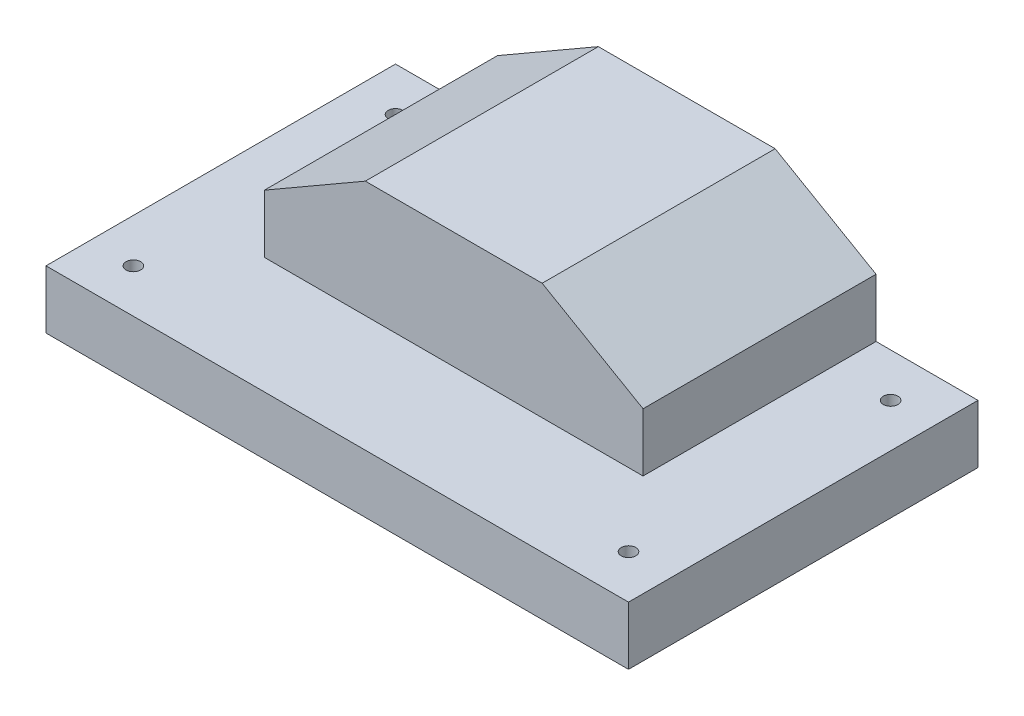
ISO-10303-21;
HEADER;
FILE_DESCRIPTION(('STEP AP214'),'2;1');
FILE_NAME('part.step','',(''),(''),'','','');
FILE_SCHEMA(('AUTOMOTIVE_DESIGN { 1 0 10303 214 1 1 1 1 }'));
ENDSEC;
DATA;
#1=APPLICATION_CONTEXT('core data for automotive mechanical design processes');
#2=APPLICATION_PROTOCOL_DEFINITION('international standard','automotive_design',2000,#1);
#3=PRODUCT_CONTEXT('',#1,'mechanical');
#4=PRODUCT('Part','Part','',(#3));
#5=PRODUCT_RELATED_PRODUCT_CATEGORY('part','',(#4));
#6=PRODUCT_DEFINITION_FORMATION('','',#4);
#7=PRODUCT_DEFINITION_CONTEXT('part definition',#1,'design');
#8=PRODUCT_DEFINITION('design','',#6,#7);
#9=PRODUCT_DEFINITION_SHAPE('','',#8);
#10=(LENGTH_UNIT() NAMED_UNIT(*) SI_UNIT(.MILLI.,.METRE.));
#11=(NAMED_UNIT(*) PLANE_ANGLE_UNIT() SI_UNIT($,.RADIAN.));
#12=(NAMED_UNIT(*) SI_UNIT($,.STERADIAN.) SOLID_ANGLE_UNIT());
#13=UNCERTAINTY_MEASURE_WITH_UNIT(LENGTH_MEASURE(1.E-05),#10,'distance_accuracy_value','');
#14=(GEOMETRIC_REPRESENTATION_CONTEXT(3) GLOBAL_UNCERTAINTY_ASSIGNED_CONTEXT((#13)) GLOBAL_UNIT_ASSIGNED_CONTEXT((#10,
#11,#12)) REPRESENTATION_CONTEXT('',''));
#15=CARTESIAN_POINT('',(0.,0.,0.));
#16=DIRECTION('',(0.,0.,1.));
#17=DIRECTION('',(1.,0.,0.));
#18=AXIS2_PLACEMENT_3D('',#15,#16,#17);
#19=CARTESIAN_POINT('',(63.5,12.7,76.2));
#20=DIRECTION('',(0.,-1.,0.));
#21=DIRECTION('',(1.,0.,0.));
#22=AXIS2_PLACEMENT_3D('',#19,#20,#21);
#23=PLANE('',#22);
#24=CARTESIAN_POINT('',(-53.975,12.7,9.525));
#25=DIRECTION('',(0.,1.,0.));
#26=DIRECTION('',(0.,0.,1.));
#27=AXIS2_PLACEMENT_3D('',#24,#25,#26);
#28=CIRCLE('',#27,1.5875);
#29=CARTESIAN_POINT('',(-53.975,12.7,11.1125));
#30=VERTEX_POINT('',#29);
#31=EDGE_CURVE('E237',#30,#30,#28,.T.);
#32=ORIENTED_EDGE('',*,*,#31,.F.);
#33=EDGE_LOOP('',(#32));
#34=FACE_BOUND('',#33,.T.);
#35=CARTESIAN_POINT('',(-53.975,12.7,66.675));
#36=DIRECTION('',(0.,1.,0.));
#37=DIRECTION('',(0.,0.,1.));
#38=AXIS2_PLACEMENT_3D('',#35,#36,#37);
#39=CIRCLE('',#38,1.5875);
#40=CARTESIAN_POINT('',(-53.975,12.7,68.2625));
#41=VERTEX_POINT('',#40);
#42=EDGE_CURVE('E241',#41,#41,#39,.T.);
#43=ORIENTED_EDGE('',*,*,#42,.F.);
#44=EDGE_LOOP('',(#43));
#45=FACE_BOUND('',#44,.T.);
#46=CARTESIAN_POINT('',(53.975,12.7,66.675));
#47=DIRECTION('',(0.,1.,0.));
#48=DIRECTION('',(0.,0.,1.));
#49=AXIS2_PLACEMENT_3D('',#46,#47,#48);
#50=CIRCLE('',#49,1.5875);
#51=CARTESIAN_POINT('',(53.975,12.7,68.2625));
#52=VERTEX_POINT('',#51);
#53=EDGE_CURVE('E245',#52,#52,#50,.T.);
#54=ORIENTED_EDGE('',*,*,#53,.F.);
#55=EDGE_LOOP('',(#54));
#56=FACE_BOUND('',#55,.T.);
#57=CARTESIAN_POINT('',(53.975,12.7,9.525));
#58=DIRECTION('',(0.,1.,0.));
#59=DIRECTION('',(0.,0.,1.));
#60=AXIS2_PLACEMENT_3D('',#57,#58,#59);
#61=CIRCLE('',#60,1.5875);
#62=CARTESIAN_POINT('',(53.975,12.7,11.1125));
#63=VERTEX_POINT('',#62);
#64=EDGE_CURVE('E248',#63,#63,#61,.T.);
#65=ORIENTED_EDGE('',*,*,#64,.F.);
#66=EDGE_LOOP('',(#65));
#67=FACE_BOUND('',#66,.T.);
#68=DIRECTION('',(0.,0.,-1.));
#69=VECTOR('',#68,1.);
#70=CARTESIAN_POINT('',(41.275,12.7,50.8));
#71=LINE('',#70,#69);
#72=CARTESIAN_POINT('',(41.275,12.7,50.8));
#73=VERTEX_POINT('',#72);
#74=CARTESIAN_POINT('',(41.275,12.7,0.));
#75=VERTEX_POINT('',#74);
#76=EDGE_CURVE('E179',#73,#75,#71,.T.);
#77=ORIENTED_EDGE('',*,*,#76,.F.);
#78=DIRECTION('',(-1.,0.,0.));
#79=VECTOR('',#78,1.);
#80=CARTESIAN_POINT('',(41.275,12.7,50.8));
#81=LINE('',#80,#79);
#82=CARTESIAN_POINT('',(-41.275,12.7,50.8));
#83=VERTEX_POINT('',#82);
#84=EDGE_CURVE('E159',#73,#83,#81,.T.);
#85=ORIENTED_EDGE('',*,*,#84,.T.);
#86=DIRECTION('',(0.,0.,-1.));
#87=VECTOR('',#86,1.);
#88=CARTESIAN_POINT('',(-41.275,12.7,50.8));
#89=LINE('',#88,#87);
#90=CARTESIAN_POINT('',(-41.275,12.7,0.));
#91=VERTEX_POINT('',#90);
#92=EDGE_CURVE('E177',#83,#91,#89,.T.);
#93=ORIENTED_EDGE('',*,*,#92,.T.);
#94=DIRECTION('',(-1.,0.,0.));
#95=VECTOR('',#94,1.);
#96=CARTESIAN_POINT('',(63.5,12.7,0.));
#97=LINE('',#96,#95);
#98=CARTESIAN_POINT('',(-63.5,12.7,0.));
#99=VERTEX_POINT('',#98);
#100=EDGE_CURVE('E174',#91,#99,#97,.T.);
#101=ORIENTED_EDGE('',*,*,#100,.T.);
#102=DIRECTION('',(0.,0.,-1.));
#103=VECTOR('',#102,1.);
#104=CARTESIAN_POINT('',(-63.5,12.7,76.2));
#105=LINE('',#104,#103);
#106=CARTESIAN_POINT('',(-63.5,12.7,76.2));
#107=VERTEX_POINT('',#106);
#108=EDGE_CURVE('E11',#107,#99,#105,.T.);
#109=ORIENTED_EDGE('',*,*,#108,.F.);
#110=DIRECTION('',(-1.,0.,0.));
#111=VECTOR('',#110,1.);
#112=CARTESIAN_POINT('',(63.5,12.7,76.2));
#113=LINE('',#112,#111);
#114=CARTESIAN_POINT('',(63.5,12.7,76.2));
#115=VERTEX_POINT('',#114);
#116=EDGE_CURVE('E182',#115,#107,#113,.T.);
#117=ORIENTED_EDGE('',*,*,#116,.F.);
#118=DIRECTION('',(0.,0.,-1.));
#119=VECTOR('',#118,1.);
#120=CARTESIAN_POINT('',(63.5,12.7,76.2));
#121=LINE('',#120,#119);
#122=CARTESIAN_POINT('',(63.5,12.7,0.));
#123=VERTEX_POINT('',#122);
#124=EDGE_CURVE('E188',#115,#123,#121,.T.);
#125=ORIENTED_EDGE('',*,*,#124,.T.);
#126=EDGE_CURVE('E189',#123,#75,#97,.T.);
#127=ORIENTED_EDGE('',*,*,#126,.T.);
#128=EDGE_LOOP('',(#77,#85,#93,#101,#109,#117,#125,#127));
#129=FACE_BOUND('',#128,.T.);
#130=ADVANCED_FACE('F40',(#34,#45,#56,#67,#129),#23,.F.);
#131=CARTESIAN_POINT('',(-63.5,12.7,76.2));
#132=DIRECTION('',(1.,0.,0.));
#133=DIRECTION('',(0.,0.,-1.));
#134=AXIS2_PLACEMENT_3D('',#131,#132,#133);
#135=PLANE('',#134);
#136=DIRECTION('',(0.,-1.,0.));
#137=VECTOR('',#136,1.);
#138=CARTESIAN_POINT('',(-63.5,12.7,0.));
#139=LINE('',#138,#137);
#140=CARTESIAN_POINT('',(-63.5,0.,0.));
#141=VERTEX_POINT('',#140);
#142=EDGE_CURVE('E192',#99,#141,#139,.T.);
#143=ORIENTED_EDGE('',*,*,#142,.T.);
#144=DIRECTION('',(0.,0.,-1.));
#145=VECTOR('',#144,1.);
#146=CARTESIAN_POINT('',(-63.5,0.,76.2));
#147=LINE('',#146,#145);
#148=CARTESIAN_POINT('',(-63.5,0.,76.2));
#149=VERTEX_POINT('',#148);
#150=EDGE_CURVE('E47',#149,#141,#147,.T.);
#151=ORIENTED_EDGE('',*,*,#150,.F.);
#152=DIRECTION('',(0.,-1.,0.));
#153=VECTOR('',#152,1.);
#154=CARTESIAN_POINT('',(-63.5,12.7,76.2));
#155=LINE('',#154,#153);
#156=EDGE_CURVE('E91',#107,#149,#155,.T.);
#157=ORIENTED_EDGE('',*,*,#156,.F.);
#158=ORIENTED_EDGE('',*,*,#108,.T.);
#159=EDGE_LOOP('',(#143,#151,#157,#158));
#160=FACE_BOUND('',#159,.T.);
#161=ADVANCED_FACE('F225',(#160),#135,.F.);
#162=CARTESIAN_POINT('',(-63.5,0.,76.2));
#163=DIRECTION('',(0.,1.,0.));
#164=DIRECTION('',(-1.,0.,0.));
#165=AXIS2_PLACEMENT_3D('',#162,#163,#164);
#166=PLANE('',#165);
#167=CARTESIAN_POINT('',(-53.975,0.,9.525));
#168=DIRECTION('',(0.,1.,0.));
#169=DIRECTION('',(0.,0.,1.));
#170=AXIS2_PLACEMENT_3D('',#167,#168,#169);
#171=CIRCLE('',#170,1.5875);
#172=CARTESIAN_POINT('',(-53.975,0.,11.1125));
#173=VERTEX_POINT('',#172);
#174=EDGE_CURVE('E260',#173,#173,#171,.T.);
#175=ORIENTED_EDGE('',*,*,#174,.T.);
#176=EDGE_LOOP('',(#175));
#177=FACE_BOUND('',#176,.T.);
#178=CARTESIAN_POINT('',(-53.975,0.,66.675));
#179=DIRECTION('',(0.,1.,0.));
#180=DIRECTION('',(0.,0.,1.));
#181=AXIS2_PLACEMENT_3D('',#178,#179,#180);
#182=CIRCLE('',#181,1.5875);
#183=CARTESIAN_POINT('',(-53.975,0.,68.2625));
#184=VERTEX_POINT('',#183);
#185=EDGE_CURVE('E256',#184,#184,#182,.T.);
#186=ORIENTED_EDGE('',*,*,#185,.T.);
#187=EDGE_LOOP('',(#186));
#188=FACE_BOUND('',#187,.T.);
#189=CARTESIAN_POINT('',(53.975,0.,66.675));
#190=DIRECTION('',(0.,1.,0.));
#191=DIRECTION('',(0.,0.,1.));
#192=AXIS2_PLACEMENT_3D('',#189,#190,#191);
#193=CIRCLE('',#192,1.5875);
#194=CARTESIAN_POINT('',(53.975,0.,68.2625));
#195=VERTEX_POINT('',#194);
#196=EDGE_CURVE('E250',#195,#195,#193,.T.);
#197=ORIENTED_EDGE('',*,*,#196,.T.);
#198=EDGE_LOOP('',(#197));
#199=FACE_BOUND('',#198,.T.);
#200=CARTESIAN_POINT('',(53.975,0.,9.525));
#201=DIRECTION('',(0.,1.,0.));
#202=DIRECTION('',(0.,0.,1.));
#203=AXIS2_PLACEMENT_3D('',#200,#201,#202);
#204=CIRCLE('',#203,1.5875);
#205=CARTESIAN_POINT('',(53.975,0.,11.1125));
#206=VERTEX_POINT('',#205);
#207=EDGE_CURVE('E155',#206,#206,#204,.T.);
#208=ORIENTED_EDGE('',*,*,#207,.T.);
#209=EDGE_LOOP('',(#208));
#210=FACE_BOUND('',#209,.T.);
#211=DIRECTION('',(1.,0.,0.));
#212=VECTOR('',#211,1.);
#213=CARTESIAN_POINT('',(-63.5,0.,0.));
#214=LINE('',#213,#212);
#215=CARTESIAN_POINT('',(63.5,0.,0.));
#216=VERTEX_POINT('',#215);
#217=EDGE_CURVE('E194',#141,#216,#214,.T.);
#218=ORIENTED_EDGE('',*,*,#217,.T.);
#219=DIRECTION('',(0.,0.,-1.));
#220=VECTOR('',#219,1.);
#221=CARTESIAN_POINT('',(63.5,0.,76.2));
#222=LINE('',#221,#220);
#223=CARTESIAN_POINT('',(63.5,0.,76.2));
#224=VERTEX_POINT('',#223);
#225=EDGE_CURVE('E198',#224,#216,#222,.T.);
#226=ORIENTED_EDGE('',*,*,#225,.F.);
#227=DIRECTION('',(1.,0.,0.));
#228=VECTOR('',#227,1.);
#229=CARTESIAN_POINT('',(-63.5,0.,76.2));
#230=LINE('',#229,#228);
#231=EDGE_CURVE('E185',#149,#224,#230,.T.);
#232=ORIENTED_EDGE('',*,*,#231,.F.);
#233=ORIENTED_EDGE('',*,*,#150,.T.);
#234=EDGE_LOOP('',(#218,#226,#232,#233));
#235=FACE_BOUND('',#234,.T.);
#236=ADVANCED_FACE('F203',(#177,#188,#199,#210,#235),#166,.F.);
#237=CARTESIAN_POINT('',(63.5,0.,76.2));
#238=DIRECTION('',(-1.,0.,0.));
#239=DIRECTION('',(0.,0.,1.));
#240=AXIS2_PLACEMENT_3D('',#237,#238,#239);
#241=PLANE('',#240);
#242=DIRECTION('',(0.,1.,0.));
#243=VECTOR('',#242,1.);
#244=CARTESIAN_POINT('',(63.5,0.,0.));
#245=LINE('',#244,#243);
#246=EDGE_CURVE('E84',#216,#123,#245,.T.);
#247=ORIENTED_EDGE('',*,*,#246,.T.);
#248=ORIENTED_EDGE('',*,*,#124,.F.);
#249=DIRECTION('',(0.,1.,0.));
#250=VECTOR('',#249,1.);
#251=CARTESIAN_POINT('',(63.5,0.,76.2));
#252=LINE('',#251,#250);
#253=EDGE_CURVE('E63',#224,#115,#252,.T.);
#254=ORIENTED_EDGE('',*,*,#253,.F.);
#255=ORIENTED_EDGE('',*,*,#225,.T.);
#256=EDGE_LOOP('',(#247,#248,#254,#255));
#257=FACE_BOUND('',#256,.T.);
#258=ADVANCED_FACE('F215',(#257),#241,.F.);
#259=CARTESIAN_POINT('',(0.,0.,76.2));
#260=DIRECTION('',(0.,0.,1.));
#261=DIRECTION('',(1.,0.,0.));
#262=AXIS2_PLACEMENT_3D('',#259,#260,#261);
#263=PLANE('',#262);
#264=ORIENTED_EDGE('',*,*,#116,.T.);
#265=ORIENTED_EDGE('',*,*,#156,.T.);
#266=ORIENTED_EDGE('',*,*,#231,.T.);
#267=ORIENTED_EDGE('',*,*,#253,.T.);
#268=EDGE_LOOP('',(#264,#265,#266,#267));
#269=FACE_BOUND('',#268,.T.);
#270=ADVANCED_FACE('F217',(#269),#263,.T.);
#271=CARTESIAN_POINT('',(0.,0.,0.));
#272=DIRECTION('',(0.,0.,1.));
#273=DIRECTION('',(1.,0.,0.));
#274=AXIS2_PLACEMENT_3D('',#271,#272,#273);
#275=PLANE('',#274);
#276=ORIENTED_EDGE('',*,*,#126,.F.);
#277=ORIENTED_EDGE('',*,*,#246,.F.);
#278=ORIENTED_EDGE('',*,*,#217,.F.);
#279=ORIENTED_EDGE('',*,*,#142,.F.);
#280=ORIENTED_EDGE('',*,*,#100,.F.);
#281=DIRECTION('',(0.,1.,0.));
#282=VECTOR('',#281,1.);
#283=CARTESIAN_POINT('',(-41.275,25.4,0.));
#284=LINE('',#283,#282);
#285=CARTESIAN_POINT('',(-41.275,25.4,0.));
#286=VERTEX_POINT('',#285);
#287=EDGE_CURVE('E54',#91,#286,#284,.T.);
#288=ORIENTED_EDGE('',*,*,#287,.T.);
#289=DIRECTION('',(0.866025403784438,0.500000000000001,0.));
#290=VECTOR('',#289,1.);
#291=CARTESIAN_POINT('',(-19.2779547438753,38.1,0.));
#292=LINE('',#291,#290);
#293=CARTESIAN_POINT('',(-19.2779547438753,38.1,0.));
#294=VERTEX_POINT('',#293);
#295=EDGE_CURVE('E150',#286,#294,#292,.T.);
#296=ORIENTED_EDGE('',*,*,#295,.T.);
#297=DIRECTION('',(1.,0.,0.));
#298=VECTOR('',#297,1.);
#299=CARTESIAN_POINT('',(19.2779547438753,38.1,0.));
#300=LINE('',#299,#298);
#301=CARTESIAN_POINT('',(19.2779547438753,38.1,0.));
#302=VERTEX_POINT('',#301);
#303=EDGE_CURVE('E166',#294,#302,#300,.T.);
#304=ORIENTED_EDGE('',*,*,#303,.T.);
#305=DIRECTION('',(0.866025403784438,-0.500000000000001,0.));
#306=VECTOR('',#305,1.);
#307=CARTESIAN_POINT('',(41.275,25.4,0.));
#308=LINE('',#307,#306);
#309=CARTESIAN_POINT('',(41.275,25.4,0.));
#310=VERTEX_POINT('',#309);
#311=EDGE_CURVE('E130',#302,#310,#308,.T.);
#312=ORIENTED_EDGE('',*,*,#311,.T.);
#313=DIRECTION('',(0.,-1.,0.));
#314=VECTOR('',#313,1.);
#315=CARTESIAN_POINT('',(41.275,12.7,0.));
#316=LINE('',#315,#314);
#317=EDGE_CURVE('E169',#310,#75,#316,.T.);
#318=ORIENTED_EDGE('',*,*,#317,.T.);
#319=EDGE_LOOP('',(#276,#277,#278,#279,#280,#288,#296,#304,#312,#318));
#320=FACE_BOUND('',#319,.T.);
#321=ADVANCED_FACE('F208',(#320),#275,.F.);
#322=CARTESIAN_POINT('',(19.2779547438753,38.1,50.8));
#323=DIRECTION('',(0.,1.,0.));
#324=DIRECTION('',(0.,0.,1.));
#325=AXIS2_PLACEMENT_3D('',#322,#323,#324);
#326=PLANE('',#325);
#327=ORIENTED_EDGE('',*,*,#303,.F.);
#328=DIRECTION('',(0.,0.,-1.));
#329=VECTOR('',#328,1.);
#330=CARTESIAN_POINT('',(-19.2779547438753,38.1,50.8));
#331=LINE('',#330,#329);
#332=CARTESIAN_POINT('',(-19.2779547438753,38.1,50.8));
#333=VERTEX_POINT('',#332);
#334=EDGE_CURVE('E149',#333,#294,#331,.T.);
#335=ORIENTED_EDGE('',*,*,#334,.F.);
#336=DIRECTION('',(1.,0.,0.));
#337=VECTOR('',#336,1.);
#338=CARTESIAN_POINT('',(19.2779547438753,38.1,50.8));
#339=LINE('',#338,#337);
#340=CARTESIAN_POINT('',(19.2779547438753,38.1,50.8));
#341=VERTEX_POINT('',#340);
#342=EDGE_CURVE('E143',#333,#341,#339,.T.);
#343=ORIENTED_EDGE('',*,*,#342,.T.);
#344=DIRECTION('',(0.,0.,-1.));
#345=VECTOR('',#344,1.);
#346=CARTESIAN_POINT('',(19.2779547438753,38.1,50.8));
#347=LINE('',#346,#345);
#348=EDGE_CURVE('E125',#341,#302,#347,.T.);
#349=ORIENTED_EDGE('',*,*,#348,.T.);
#350=EDGE_LOOP('',(#327,#335,#343,#349));
#351=FACE_BOUND('',#350,.T.);
#352=ADVANCED_FACE('F148',(#351),#326,.T.);
#353=CARTESIAN_POINT('',(-19.2779547438753,38.1,50.8));
#354=DIRECTION('',(-0.500000000000001,0.866025403784438,0.));
#355=DIRECTION('',(-0.866025403784438,-0.500000000000001,0.));
#356=AXIS2_PLACEMENT_3D('',#353,#354,#355);
#357=PLANE('',#356);
#358=ORIENTED_EDGE('',*,*,#295,.F.);
#359=DIRECTION('',(0.,0.,-1.));
#360=VECTOR('',#359,1.);
#361=CARTESIAN_POINT('',(-41.275,25.4,50.8));
#362=LINE('',#361,#360);
#363=CARTESIAN_POINT('',(-41.275,25.4,50.8));
#364=VERTEX_POINT('',#363);
#365=EDGE_CURVE('E175',#364,#286,#362,.T.);
#366=ORIENTED_EDGE('',*,*,#365,.F.);
#367=DIRECTION('',(0.866025403784438,0.500000000000001,0.));
#368=VECTOR('',#367,1.);
#369=CARTESIAN_POINT('',(-19.2779547438753,38.1,50.8));
#370=LINE('',#369,#368);
#371=EDGE_CURVE('E136',#364,#333,#370,.T.);
#372=ORIENTED_EDGE('',*,*,#371,.T.);
#373=ORIENTED_EDGE('',*,*,#334,.T.);
#374=EDGE_LOOP('',(#358,#366,#372,#373));
#375=FACE_BOUND('',#374,.T.);
#376=ADVANCED_FACE('F285',(#375),#357,.T.);
#377=CARTESIAN_POINT('',(-41.275,25.4,50.8));
#378=DIRECTION('',(-1.,0.,0.));
#379=DIRECTION('',(0.,0.,1.));
#380=AXIS2_PLACEMENT_3D('',#377,#378,#379);
#381=PLANE('',#380);
#382=ORIENTED_EDGE('',*,*,#287,.F.);
#383=ORIENTED_EDGE('',*,*,#92,.F.);
#384=DIRECTION('',(0.,1.,0.));
#385=VECTOR('',#384,1.);
#386=CARTESIAN_POINT('',(-41.275,25.4,50.8));
#387=LINE('',#386,#385);
#388=EDGE_CURVE('E162',#83,#364,#387,.T.);
#389=ORIENTED_EDGE('',*,*,#388,.T.);
#390=ORIENTED_EDGE('',*,*,#365,.T.);
#391=EDGE_LOOP('',(#382,#383,#389,#390));
#392=FACE_BOUND('',#391,.T.);
#393=ADVANCED_FACE('F288',(#392),#381,.T.);
#394=CARTESIAN_POINT('',(41.275,12.7,50.8));
#395=DIRECTION('',(1.,0.,0.));
#396=DIRECTION('',(0.,0.,-1.));
#397=AXIS2_PLACEMENT_3D('',#394,#395,#396);
#398=PLANE('',#397);
#399=ORIENTED_EDGE('',*,*,#317,.F.);
#400=DIRECTION('',(0.,0.,-1.));
#401=VECTOR('',#400,1.);
#402=CARTESIAN_POINT('',(41.275,25.4,50.8));
#403=LINE('',#402,#401);
#404=CARTESIAN_POINT('',(41.275,25.4,50.8));
#405=VERTEX_POINT('',#404);
#406=EDGE_CURVE('E135',#405,#310,#403,.T.);
#407=ORIENTED_EDGE('',*,*,#406,.F.);
#408=DIRECTION('',(0.,-1.,0.));
#409=VECTOR('',#408,1.);
#410=CARTESIAN_POINT('',(41.275,12.7,50.8));
#411=LINE('',#410,#409);
#412=EDGE_CURVE('E146',#405,#73,#411,.T.);
#413=ORIENTED_EDGE('',*,*,#412,.T.);
#414=ORIENTED_EDGE('',*,*,#76,.T.);
#415=EDGE_LOOP('',(#399,#407,#413,#414));
#416=FACE_BOUND('',#415,.T.);
#417=ADVANCED_FACE('F292',(#416),#398,.T.);
#418=CARTESIAN_POINT('',(41.275,25.4,50.8));
#419=DIRECTION('',(0.500000000000001,0.866025403784438,0.));
#420=DIRECTION('',(-0.866025403784438,0.500000000000001,0.));
#421=AXIS2_PLACEMENT_3D('',#418,#419,#420);
#422=PLANE('',#421);
#423=ORIENTED_EDGE('',*,*,#311,.F.);
#424=ORIENTED_EDGE('',*,*,#348,.F.);
#425=DIRECTION('',(0.866025403784438,-0.500000000000001,0.));
#426=VECTOR('',#425,1.);
#427=CARTESIAN_POINT('',(41.275,25.4,50.8));
#428=LINE('',#427,#426);
#429=EDGE_CURVE('E128',#341,#405,#428,.T.);
#430=ORIENTED_EDGE('',*,*,#429,.T.);
#431=ORIENTED_EDGE('',*,*,#406,.T.);
#432=EDGE_LOOP('',(#423,#424,#430,#431));
#433=FACE_BOUND('',#432,.T.);
#434=ADVANCED_FACE('F127',(#433),#422,.T.);
#435=CARTESIAN_POINT('',(0.,0.,50.8));
#436=DIRECTION('',(0.,0.,1.));
#437=DIRECTION('',(1.,0.,0.));
#438=AXIS2_PLACEMENT_3D('',#435,#436,#437);
#439=PLANE('',#438);
#440=ORIENTED_EDGE('',*,*,#342,.F.);
#441=ORIENTED_EDGE('',*,*,#371,.F.);
#442=ORIENTED_EDGE('',*,*,#388,.F.);
#443=ORIENTED_EDGE('',*,*,#84,.F.);
#444=ORIENTED_EDGE('',*,*,#412,.F.);
#445=ORIENTED_EDGE('',*,*,#429,.F.);
#446=EDGE_LOOP('',(#440,#441,#442,#443,#444,#445));
#447=FACE_BOUND('',#446,.T.);
#448=ADVANCED_FACE('F141',(#447),#439,.T.);
#449=CARTESIAN_POINT('',(53.975,12.7,9.525));
#450=DIRECTION('',(0.,1.,0.));
#451=DIRECTION('',(0.,0.,1.));
#452=AXIS2_PLACEMENT_3D('',#449,#450,#451);
#453=CYLINDRICAL_SURFACE('',#452,1.5875);
#454=ORIENTED_EDGE('',*,*,#207,.F.);
#455=EDGE_LOOP('',(#454));
#456=FACE_BOUND('',#455,.T.);
#457=ORIENTED_EDGE('',*,*,#64,.T.);
#458=EDGE_LOOP('',(#457));
#459=FACE_BOUND('',#458,.T.);
#460=ADVANCED_FACE('F279',(#456,#459),#453,.F.);
#461=CARTESIAN_POINT('',(53.975,12.7,66.675));
#462=DIRECTION('',(0.,1.,0.));
#463=DIRECTION('',(0.,0.,1.));
#464=AXIS2_PLACEMENT_3D('',#461,#462,#463);
#465=CYLINDRICAL_SURFACE('',#464,1.5875);
#466=ORIENTED_EDGE('',*,*,#196,.F.);
#467=EDGE_LOOP('',(#466));
#468=FACE_BOUND('',#467,.T.);
#469=ORIENTED_EDGE('',*,*,#53,.T.);
#470=EDGE_LOOP('',(#469));
#471=FACE_BOUND('',#470,.T.);
#472=ADVANCED_FACE('F272',(#468,#471),#465,.F.);
#473=CARTESIAN_POINT('',(-53.975,12.7,66.675));
#474=DIRECTION('',(0.,1.,0.));
#475=DIRECTION('',(0.,0.,1.));
#476=AXIS2_PLACEMENT_3D('',#473,#474,#475);
#477=CYLINDRICAL_SURFACE('',#476,1.5875);
#478=ORIENTED_EDGE('',*,*,#185,.F.);
#479=EDGE_LOOP('',(#478));
#480=FACE_BOUND('',#479,.T.);
#481=ORIENTED_EDGE('',*,*,#42,.T.);
#482=EDGE_LOOP('',(#481));
#483=FACE_BOUND('',#482,.T.);
#484=ADVANCED_FACE('F266',(#480,#483),#477,.F.);
#485=CARTESIAN_POINT('',(-53.975,12.7,9.525));
#486=DIRECTION('',(0.,1.,0.));
#487=DIRECTION('',(0.,0.,1.));
#488=AXIS2_PLACEMENT_3D('',#485,#486,#487);
#489=CYLINDRICAL_SURFACE('',#488,1.5875);
#490=ORIENTED_EDGE('',*,*,#174,.F.);
#491=EDGE_LOOP('',(#490));
#492=FACE_BOUND('',#491,.T.);
#493=ORIENTED_EDGE('',*,*,#31,.T.);
#494=EDGE_LOOP('',(#493));
#495=FACE_BOUND('',#494,.T.);
#496=ADVANCED_FACE('F264',(#492,#495),#489,.F.);
#497=CLOSED_SHELL('',(#130,#161,#236,#258,#270,#321,#352,#376,#393,#417,#434,#448,#460,#472,
#484,#496));
#498=MANIFOLD_SOLID_BREP('B2',#497);
#499=ADVANCED_BREP_SHAPE_REPRESENTATION('',(#18,#498),#14);
#500=SHAPE_DEFINITION_REPRESENTATION(#9,#499);
ENDSEC;
END-ISO-10303-21;
